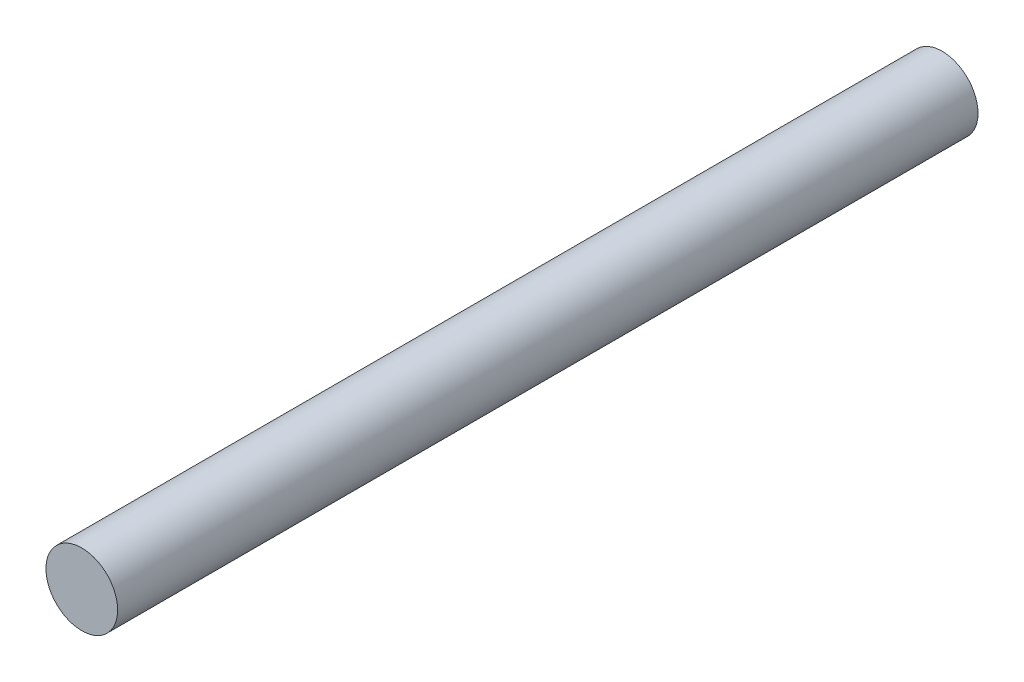
ISO-10303-21;
HEADER;
FILE_DESCRIPTION(('STEP AP214'),'2;1');
FILE_NAME('part.step','',(''),(''),'','','');
FILE_SCHEMA(('AUTOMOTIVE_DESIGN { 1 0 10303 214 1 1 1 1 }'));
ENDSEC;
DATA;
#1=APPLICATION_CONTEXT('core data for automotive mechanical design processes');
#2=APPLICATION_PROTOCOL_DEFINITION('international standard','automotive_design',2000,#1);
#3=PRODUCT_CONTEXT('',#1,'mechanical');
#4=PRODUCT('Part','Part','',(#3));
#5=PRODUCT_RELATED_PRODUCT_CATEGORY('part','',(#4));
#6=PRODUCT_DEFINITION_FORMATION('','',#4);
#7=PRODUCT_DEFINITION_CONTEXT('part definition',#1,'design');
#8=PRODUCT_DEFINITION('design','',#6,#7);
#9=PRODUCT_DEFINITION_SHAPE('','',#8);
#10=(LENGTH_UNIT() NAMED_UNIT(*) SI_UNIT(.MILLI.,.METRE.));
#11=(NAMED_UNIT(*) PLANE_ANGLE_UNIT() SI_UNIT($,.RADIAN.));
#12=(NAMED_UNIT(*) SI_UNIT($,.STERADIAN.) SOLID_ANGLE_UNIT());
#13=UNCERTAINTY_MEASURE_WITH_UNIT(LENGTH_MEASURE(1.E-05),#10,'distance_accuracy_value','');
#14=(GEOMETRIC_REPRESENTATION_CONTEXT(3) GLOBAL_UNCERTAINTY_ASSIGNED_CONTEXT((#13)) GLOBAL_UNIT_ASSIGNED_CONTEXT((#10,
#11,#12)) REPRESENTATION_CONTEXT('',''));
#15=CARTESIAN_POINT('',(0.,0.,0.));
#16=DIRECTION('',(0.,0.,1.));
#17=DIRECTION('',(1.,0.,0.));
#18=AXIS2_PLACEMENT_3D('',#15,#16,#17);
#19=CARTESIAN_POINT('',(0.,0.,24.));
#20=DIRECTION('',(0.,0.,-1.));
#21=DIRECTION('',(-1.,0.,0.));
#22=AXIS2_PLACEMENT_3D('',#19,#20,#21);
#23=CYLINDRICAL_SURFACE('',#22,1.);
#24=CARTESIAN_POINT('',(0.,0.,24.));
#25=DIRECTION('',(0.,0.,1.));
#26=DIRECTION('',(1.,0.,0.));
#27=AXIS2_PLACEMENT_3D('',#24,#25,#26);
#28=CIRCLE('',#27,1.);
#29=CARTESIAN_POINT('',(1.,0.,24.));
#30=VERTEX_POINT('',#29);
#31=EDGE_CURVE('E10',#30,#30,#28,.T.);
#32=ORIENTED_EDGE('',*,*,#31,.F.);
#33=EDGE_LOOP('',(#32));
#34=FACE_BOUND('',#33,.T.);
#35=CARTESIAN_POINT('',(0.,0.,0.));
#36=DIRECTION('',(0.,0.,1.));
#37=DIRECTION('',(1.,0.,0.));
#38=AXIS2_PLACEMENT_3D('',#35,#36,#37);
#39=CIRCLE('',#38,1.);
#40=CARTESIAN_POINT('',(1.,0.,0.));
#41=VERTEX_POINT('',#40);
#42=EDGE_CURVE('E34',#41,#41,#39,.T.);
#43=ORIENTED_EDGE('',*,*,#42,.T.);
#44=EDGE_LOOP('',(#43));
#45=FACE_BOUND('',#44,.T.);
#46=ADVANCED_FACE('F31',(#34,#45),#23,.T.);
#47=CARTESIAN_POINT('',(0.,0.,24.));
#48=DIRECTION('',(0.,0.,1.));
#49=DIRECTION('',(1.,0.,0.));
#50=AXIS2_PLACEMENT_3D('',#47,#48,#49);
#51=PLANE('',#50);
#52=ORIENTED_EDGE('',*,*,#31,.T.);
#53=EDGE_LOOP('',(#52));
#54=FACE_BOUND('',#53,.T.);
#55=ADVANCED_FACE('F46',(#54),#51,.T.);
#56=CARTESIAN_POINT('',(0.,0.,0.));
#57=DIRECTION('',(0.,0.,1.));
#58=DIRECTION('',(1.,0.,0.));
#59=AXIS2_PLACEMENT_3D('',#56,#57,#58);
#60=PLANE('',#59);
#61=ORIENTED_EDGE('',*,*,#42,.F.);
#62=EDGE_LOOP('',(#61));
#63=FACE_BOUND('',#62,.T.);
#64=ADVANCED_FACE('F44',(#63),#60,.F.);
#65=CLOSED_SHELL('',(#46,#55,#64));
#66=MANIFOLD_SOLID_BREP('B2',#65);
#67=ADVANCED_BREP_SHAPE_REPRESENTATION('',(#18,#66),#14);
#68=SHAPE_DEFINITION_REPRESENTATION(#9,#67);
ENDSEC;
END-ISO-10303-21;
